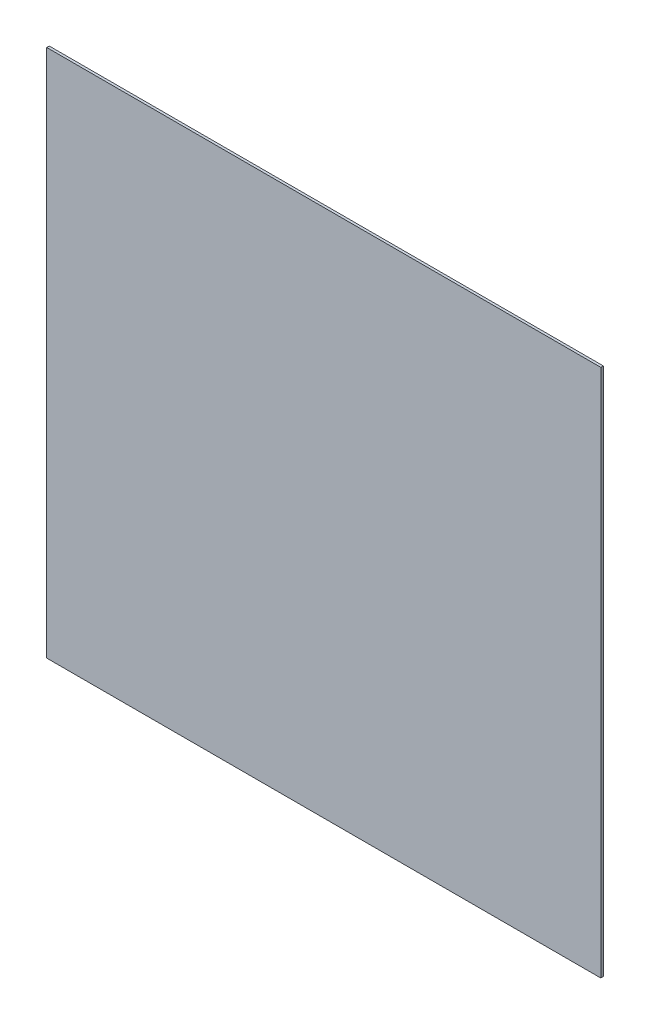
ISO-10303-21;
HEADER;
FILE_DESCRIPTION(('STEP AP214'),'2;1');
FILE_NAME('part.step','',(''),(''),'','','');
FILE_SCHEMA(('AUTOMOTIVE_DESIGN { 1 0 10303 214 1 1 1 1 }'));
ENDSEC;
DATA;
#1=APPLICATION_CONTEXT('core data for automotive mechanical design processes');
#2=APPLICATION_PROTOCOL_DEFINITION('international standard','automotive_design',2000,#1);
#3=PRODUCT_CONTEXT('',#1,'mechanical');
#4=PRODUCT('Part','Part','',(#3));
#5=PRODUCT_RELATED_PRODUCT_CATEGORY('part','',(#4));
#6=PRODUCT_DEFINITION_FORMATION('','',#4);
#7=PRODUCT_DEFINITION_CONTEXT('part definition',#1,'design');
#8=PRODUCT_DEFINITION('design','',#6,#7);
#9=PRODUCT_DEFINITION_SHAPE('','',#8);
#10=(LENGTH_UNIT() NAMED_UNIT(*) SI_UNIT(.MILLI.,.METRE.));
#11=(NAMED_UNIT(*) PLANE_ANGLE_UNIT() SI_UNIT($,.RADIAN.));
#12=(NAMED_UNIT(*) SI_UNIT($,.STERADIAN.) SOLID_ANGLE_UNIT());
#13=UNCERTAINTY_MEASURE_WITH_UNIT(LENGTH_MEASURE(1.E-05),#10,'distance_accuracy_value','');
#14=(GEOMETRIC_REPRESENTATION_CONTEXT(3) GLOBAL_UNCERTAINTY_ASSIGNED_CONTEXT((#13)) GLOBAL_UNIT_ASSIGNED_CONTEXT((#10,
#11,#12)) REPRESENTATION_CONTEXT('',''));
#15=CARTESIAN_POINT('',(0.,0.,0.));
#16=DIRECTION('',(0.,0.,1.));
#17=DIRECTION('',(1.,0.,0.));
#18=AXIS2_PLACEMENT_3D('',#15,#16,#17);
#19=CARTESIAN_POINT('',(220.,259.117470253832,2.));
#20=DIRECTION('',(0.,-1.,0.));
#21=DIRECTION('',(0.,0.,-1.));
#22=AXIS2_PLACEMENT_3D('',#19,#20,#21);
#23=PLANE('',#22);
#24=DIRECTION('',(-1.,0.,0.));
#25=VECTOR('',#24,1.);
#26=CARTESIAN_POINT('',(220.,259.117470253832,0.));
#27=LINE('',#26,#25);
#28=CARTESIAN_POINT('',(220.,259.117470253832,0.));
#29=VERTEX_POINT('',#28);
#30=CARTESIAN_POINT('',(-220.,259.117470253832,0.));
#31=VERTEX_POINT('',#30);
#32=EDGE_CURVE('E107',#29,#31,#27,.T.);
#33=ORIENTED_EDGE('',*,*,#32,.T.);
#34=DIRECTION('',(0.,0.,-1.));
#35=VECTOR('',#34,1.);
#36=CARTESIAN_POINT('',(-220.,259.117470253832,2.));
#37=LINE('',#36,#35);
#38=CARTESIAN_POINT('',(-220.,259.117470253832,2.));
#39=VERTEX_POINT('',#38);
#40=EDGE_CURVE('E11',#39,#31,#37,.T.);
#41=ORIENTED_EDGE('',*,*,#40,.F.);
#42=DIRECTION('',(-1.,0.,0.));
#43=VECTOR('',#42,1.);
#44=CARTESIAN_POINT('',(220.,259.117470253832,2.));
#45=LINE('',#44,#43);
#46=CARTESIAN_POINT('',(220.,259.117470253832,2.));
#47=VERTEX_POINT('',#46);
#48=EDGE_CURVE('E91',#47,#39,#45,.T.);
#49=ORIENTED_EDGE('',*,*,#48,.F.);
#50=DIRECTION('',(0.,0.,-1.));
#51=VECTOR('',#50,1.);
#52=CARTESIAN_POINT('',(220.,259.117470253832,2.));
#53=LINE('',#52,#51);
#54=EDGE_CURVE('E103',#47,#29,#53,.T.);
#55=ORIENTED_EDGE('',*,*,#54,.T.);
#56=EDGE_LOOP('',(#33,#41,#49,#55));
#57=FACE_BOUND('',#56,.T.);
#58=ADVANCED_FACE('F39',(#57),#23,.F.);
#59=CARTESIAN_POINT('',(-220.,259.117470253832,2.));
#60=DIRECTION('',(1.,0.,0.));
#61=DIRECTION('',(0.,1.,0.));
#62=AXIS2_PLACEMENT_3D('',#59,#60,#61);
#63=PLANE('',#62);
#64=DIRECTION('',(0.,-1.,0.));
#65=VECTOR('',#64,1.);
#66=CARTESIAN_POINT('',(-220.,259.117470253832,0.));
#67=LINE('',#66,#65);
#68=CARTESIAN_POINT('',(-220.,-160.882529746168,0.));
#69=VERTEX_POINT('',#68);
#70=EDGE_CURVE('E96',#31,#69,#67,.T.);
#71=ORIENTED_EDGE('',*,*,#70,.T.);
#72=DIRECTION('',(0.,0.,-1.));
#73=VECTOR('',#72,1.);
#74=CARTESIAN_POINT('',(-220.,-160.882529746168,2.));
#75=LINE('',#74,#73);
#76=CARTESIAN_POINT('',(-220.,-160.882529746168,2.));
#77=VERTEX_POINT('',#76);
#78=EDGE_CURVE('E48',#77,#69,#75,.T.);
#79=ORIENTED_EDGE('',*,*,#78,.F.);
#80=DIRECTION('',(0.,-1.,0.));
#81=VECTOR('',#80,1.);
#82=CARTESIAN_POINT('',(-220.,259.117470253832,2.));
#83=LINE('',#82,#81);
#84=EDGE_CURVE('E86',#39,#77,#83,.T.);
#85=ORIENTED_EDGE('',*,*,#84,.F.);
#86=ORIENTED_EDGE('',*,*,#40,.T.);
#87=EDGE_LOOP('',(#71,#79,#85,#86));
#88=FACE_BOUND('',#87,.T.);
#89=ADVANCED_FACE('F95',(#88),#63,.F.);
#90=CARTESIAN_POINT('',(-220.,-160.882529746168,2.));
#91=DIRECTION('',(0.,1.,0.));
#92=DIRECTION('',(-1.,0.,0.));
#93=AXIS2_PLACEMENT_3D('',#90,#91,#92);
#94=PLANE('',#93);
#95=DIRECTION('',(1.,0.,0.));
#96=VECTOR('',#95,1.);
#97=CARTESIAN_POINT('',(-220.,-160.882529746168,0.));
#98=LINE('',#97,#96);
#99=CARTESIAN_POINT('',(220.,-160.882529746168,0.));
#100=VERTEX_POINT('',#99);
#101=EDGE_CURVE('E73',#69,#100,#98,.T.);
#102=ORIENTED_EDGE('',*,*,#101,.T.);
#103=DIRECTION('',(0.,0.,-1.));
#104=VECTOR('',#103,1.);
#105=CARTESIAN_POINT('',(220.,-160.882529746168,2.));
#106=LINE('',#105,#104);
#107=CARTESIAN_POINT('',(220.,-160.882529746168,2.));
#108=VERTEX_POINT('',#107);
#109=EDGE_CURVE('E98',#108,#100,#106,.T.);
#110=ORIENTED_EDGE('',*,*,#109,.F.);
#111=DIRECTION('',(1.,0.,0.));
#112=VECTOR('',#111,1.);
#113=CARTESIAN_POINT('',(-220.,-160.882529746168,2.));
#114=LINE('',#113,#112);
#115=EDGE_CURVE('E89',#77,#108,#114,.T.);
#116=ORIENTED_EDGE('',*,*,#115,.F.);
#117=ORIENTED_EDGE('',*,*,#78,.T.);
#118=EDGE_LOOP('',(#102,#110,#116,#117));
#119=FACE_BOUND('',#118,.T.);
#120=ADVANCED_FACE('F99',(#119),#94,.F.);
#121=CARTESIAN_POINT('',(220.,-160.882529746168,2.));
#122=DIRECTION('',(-1.,0.,0.));
#123=DIRECTION('',(0.,0.,1.));
#124=AXIS2_PLACEMENT_3D('',#121,#122,#123);
#125=PLANE('',#124);
#126=DIRECTION('',(0.,1.,0.));
#127=VECTOR('',#126,1.);
#128=CARTESIAN_POINT('',(220.,-160.882529746168,0.));
#129=LINE('',#128,#127);
#130=EDGE_CURVE('E79',#100,#29,#129,.T.);
#131=ORIENTED_EDGE('',*,*,#130,.T.);
#132=ORIENTED_EDGE('',*,*,#54,.F.);
#133=DIRECTION('',(0.,1.,0.));
#134=VECTOR('',#133,1.);
#135=CARTESIAN_POINT('',(220.,-160.882529746168,2.));
#136=LINE('',#135,#134);
#137=EDGE_CURVE('E56',#108,#47,#136,.T.);
#138=ORIENTED_EDGE('',*,*,#137,.F.);
#139=ORIENTED_EDGE('',*,*,#109,.T.);
#140=EDGE_LOOP('',(#131,#132,#138,#139));
#141=FACE_BOUND('',#140,.T.);
#142=ADVANCED_FACE('F120',(#141),#125,.F.);
#143=CARTESIAN_POINT('',(0.,0.,2.));
#144=DIRECTION('',(0.,0.,1.));
#145=DIRECTION('',(1.,0.,0.));
#146=AXIS2_PLACEMENT_3D('',#143,#144,#145);
#147=PLANE('',#146);
#148=ORIENTED_EDGE('',*,*,#48,.T.);
#149=ORIENTED_EDGE('',*,*,#84,.T.);
#150=ORIENTED_EDGE('',*,*,#115,.T.);
#151=ORIENTED_EDGE('',*,*,#137,.T.);
#152=EDGE_LOOP('',(#148,#149,#150,#151));
#153=FACE_BOUND('',#152,.T.);
#154=ADVANCED_FACE('F87',(#153),#147,.T.);
#155=CARTESIAN_POINT('',(0.,0.,0.));
#156=DIRECTION('',(0.,0.,1.));
#157=DIRECTION('',(1.,0.,0.));
#158=AXIS2_PLACEMENT_3D('',#155,#156,#157);
#159=PLANE('',#158);
#160=ORIENTED_EDGE('',*,*,#32,.F.);
#161=ORIENTED_EDGE('',*,*,#130,.F.);
#162=ORIENTED_EDGE('',*,*,#101,.F.);
#163=ORIENTED_EDGE('',*,*,#70,.F.);
#164=EDGE_LOOP('',(#160,#161,#162,#163));
#165=FACE_BOUND('',#164,.T.);
#166=ADVANCED_FACE('F123',(#165),#159,.F.);
#167=CLOSED_SHELL('',(#58,#89,#120,#142,#154,#166));
#168=MANIFOLD_SOLID_BREP('B2',#167);
#169=ADVANCED_BREP_SHAPE_REPRESENTATION('',(#18,#168),#14);
#170=SHAPE_DEFINITION_REPRESENTATION(#9,#169);
ENDSEC;
END-ISO-10303-21;
